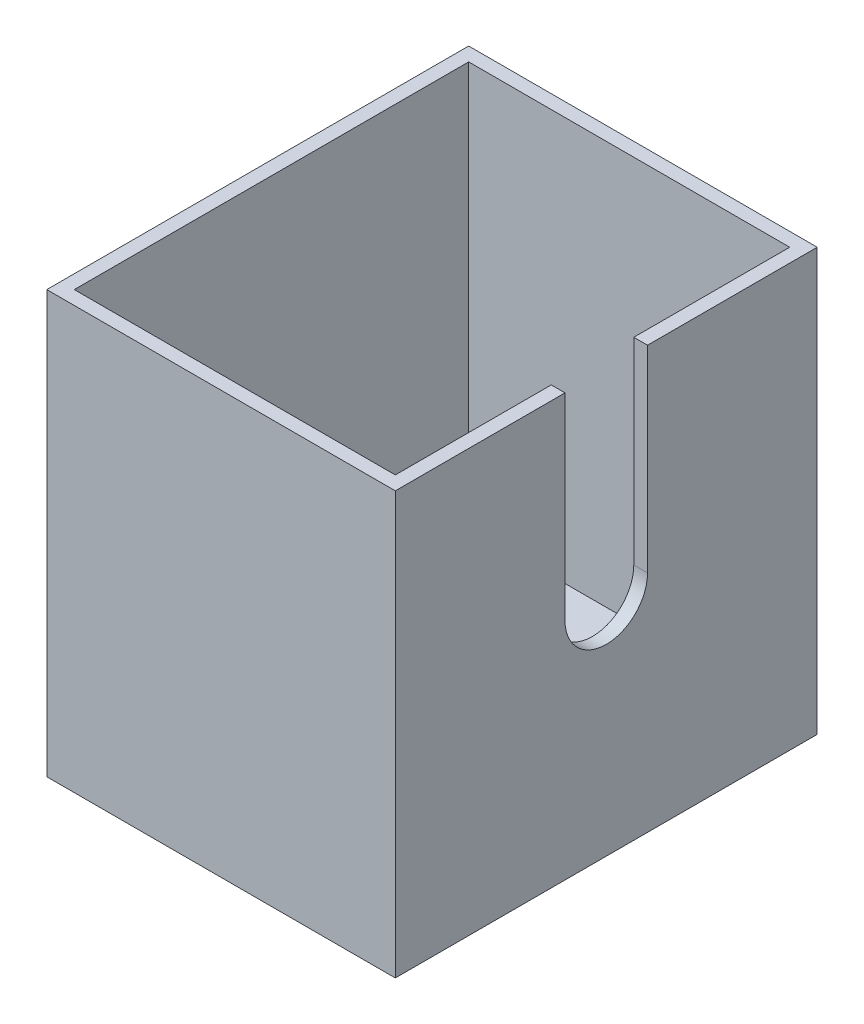
ISO-10303-21;
HEADER;
FILE_DESCRIPTION(('STEP AP214'),'2;1');
FILE_NAME('part.step','',(''),(''),'','','');
FILE_SCHEMA(('AUTOMOTIVE_DESIGN { 1 0 10303 214 1 1 1 1 }'));
ENDSEC;
DATA;
#1=APPLICATION_CONTEXT('core data for automotive mechanical design processes');
#2=APPLICATION_PROTOCOL_DEFINITION('international standard','automotive_design',2000,#1);
#3=PRODUCT_CONTEXT('',#1,'mechanical');
#4=PRODUCT('Part','Part','',(#3));
#5=PRODUCT_RELATED_PRODUCT_CATEGORY('part','',(#4));
#6=PRODUCT_DEFINITION_FORMATION('','',#4);
#7=PRODUCT_DEFINITION_CONTEXT('part definition',#1,'design');
#8=PRODUCT_DEFINITION('design','',#6,#7);
#9=PRODUCT_DEFINITION_SHAPE('','',#8);
#10=(LENGTH_UNIT() NAMED_UNIT(*) SI_UNIT(.MILLI.,.METRE.));
#11=(NAMED_UNIT(*) PLANE_ANGLE_UNIT() SI_UNIT($,.RADIAN.));
#12=(NAMED_UNIT(*) SI_UNIT($,.STERADIAN.) SOLID_ANGLE_UNIT());
#13=UNCERTAINTY_MEASURE_WITH_UNIT(LENGTH_MEASURE(1.E-05),#10,'distance_accuracy_value','');
#14=(GEOMETRIC_REPRESENTATION_CONTEXT(3) GLOBAL_UNCERTAINTY_ASSIGNED_CONTEXT((#13)) GLOBAL_UNIT_ASSIGNED_CONTEXT((#10,
#11,#12)) REPRESENTATION_CONTEXT('',''));
#15=CARTESIAN_POINT('',(0.,0.,0.));
#16=DIRECTION('',(0.,0.,1.));
#17=DIRECTION('',(1.,0.,0.));
#18=AXIS2_PLACEMENT_3D('',#15,#16,#17);
#19=CARTESIAN_POINT('',(129.653184518172,-19.9,52.2));
#20=DIRECTION('',(0.,1.,0.));
#21=DIRECTION('',(-1.,0.,0.));
#22=AXIS2_PLACEMENT_3D('',#19,#20,#21);
#23=PLANE('',#22);
#24=DIRECTION('',(0.,0.,1.));
#25=VECTOR('',#24,1.);
#26=CARTESIAN_POINT('',(-15.9,-19.9,52.2));
#27=LINE('',#26,#25);
#28=CARTESIAN_POINT('',(-15.9,-19.9,3.1));
#29=VERTEX_POINT('',#28);
#30=CARTESIAN_POINT('',(-15.9,-19.9,49.1));
#31=VERTEX_POINT('',#30);
#32=EDGE_CURVE('E204',#29,#31,#27,.T.);
#33=ORIENTED_EDGE('',*,*,#32,.F.);
#34=DIRECTION('',(1.,0.,0.));
#35=VECTOR('',#34,1.);
#36=CARTESIAN_POINT('',(22.1,-19.9,3.1));
#37=LINE('',#36,#35);
#38=CARTESIAN_POINT('',(22.1,-19.9,3.1));
#39=VERTEX_POINT('',#38);
#40=EDGE_CURVE('E183',#29,#39,#37,.T.);
#41=ORIENTED_EDGE('',*,*,#40,.T.);
#42=DIRECTION('',(0.,0.,1.));
#43=VECTOR('',#42,1.);
#44=CARTESIAN_POINT('',(22.1,-19.9,52.2));
#45=LINE('',#44,#43);
#46=CARTESIAN_POINT('',(22.1,-19.9,49.1));
#47=VERTEX_POINT('',#46);
#48=EDGE_CURVE('E206',#39,#47,#45,.T.);
#49=ORIENTED_EDGE('',*,*,#48,.T.);
#50=DIRECTION('',(1.,0.,0.));
#51=VECTOR('',#50,1.);
#52=CARTESIAN_POINT('',(22.1,-19.9,49.1));
#53=LINE('',#52,#51);
#54=EDGE_CURVE('E194',#31,#47,#53,.T.);
#55=ORIENTED_EDGE('',*,*,#54,.F.);
#56=EDGE_LOOP('',(#33,#41,#49,#55));
#57=FACE_BOUND('',#56,.T.);
#58=ADVANCED_FACE('F33',(#57),#23,.F.);
#59=CARTESIAN_POINT('',(22.1,26.1,52.2));
#60=DIRECTION('',(-1.,0.,0.));
#61=DIRECTION('',(0.,-1.,0.));
#62=AXIS2_PLACEMENT_3D('',#59,#60,#61);
#63=PLANE('',#62);
#64=ORIENTED_EDGE('',*,*,#48,.F.);
#65=DIRECTION('',(0.,-1.,0.));
#66=VECTOR('',#65,1.);
#67=CARTESIAN_POINT('',(22.1,188.847401986937,3.1));
#68=LINE('',#67,#66);
#69=CARTESIAN_POINT('',(22.1,26.1,3.1));
#70=VERTEX_POINT('',#69);
#71=EDGE_CURVE('E190',#70,#39,#68,.T.);
#72=ORIENTED_EDGE('',*,*,#71,.F.);
#73=DIRECTION('',(0.,0.,-1.));
#74=VECTOR('',#73,1.);
#75=CARTESIAN_POINT('',(22.1,26.1,52.2));
#76=LINE('',#75,#74);
#77=CARTESIAN_POINT('',(22.1,26.1,21.6));
#78=VERTEX_POINT('',#77);
#79=EDGE_CURVE('E41',#78,#70,#76,.T.);
#80=ORIENTED_EDGE('',*,*,#79,.F.);
#81=DIRECTION('',(0.,-1.,0.));
#82=VECTOR('',#81,1.);
#83=CARTESIAN_POINT('',(22.1,26.1,21.6));
#84=LINE('',#83,#82);
#85=CARTESIAN_POINT('',(22.1,4.6,21.6));
#86=VERTEX_POINT('',#85);
#87=EDGE_CURVE('E48',#78,#86,#84,.T.);
#88=ORIENTED_EDGE('',*,*,#87,.T.);
#89=CARTESIAN_POINT('',(22.1,4.6,26.1));
#90=DIRECTION('',(-1.,0.,0.));
#91=DIRECTION('',(0.,-1.,0.));
#92=AXIS2_PLACEMENT_3D('',#89,#90,#91);
#93=CIRCLE('',#92,4.5);
#94=CARTESIAN_POINT('',(22.1,4.6,30.6));
#95=VERTEX_POINT('',#94);
#96=EDGE_CURVE('E52',#86,#95,#93,.T.);
#97=ORIENTED_EDGE('',*,*,#96,.T.);
#98=DIRECTION('',(0.,1.,0.));
#99=VECTOR('',#98,1.);
#100=CARTESIAN_POINT('',(22.1,26.1,30.6));
#101=LINE('',#100,#99);
#102=CARTESIAN_POINT('',(22.1,26.1,30.6));
#103=VERTEX_POINT('',#102);
#104=EDGE_CURVE('E143',#95,#103,#101,.T.);
#105=ORIENTED_EDGE('',*,*,#104,.T.);
#106=CARTESIAN_POINT('',(22.1,26.1,49.1));
#107=VERTEX_POINT('',#106);
#108=EDGE_CURVE('E11',#107,#103,#76,.T.);
#109=ORIENTED_EDGE('',*,*,#108,.F.);
#110=DIRECTION('',(0.,-1.,0.));
#111=VECTOR('',#110,1.);
#112=CARTESIAN_POINT('',(22.1,198.903184518172,49.1));
#113=LINE('',#112,#111);
#114=EDGE_CURVE('E201',#107,#47,#113,.T.);
#115=ORIENTED_EDGE('',*,*,#114,.T.);
#116=EDGE_LOOP('',(#64,#72,#80,#88,#97,#105,#109,#115));
#117=FACE_BOUND('',#116,.T.);
#118=ADVANCED_FACE('F35',(#117),#63,.F.);
#119=CARTESIAN_POINT('',(-22.1,26.1,52.2));
#120=DIRECTION('',(0.,-1.,0.));
#121=DIRECTION('',(0.,0.,-1.));
#122=AXIS2_PLACEMENT_3D('',#119,#120,#121);
#123=PLANE('',#122);
#124=DIRECTION('',(1.,0.,0.));
#125=VECTOR('',#124,1.);
#126=CARTESIAN_POINT('',(22.1,26.1,3.1));
#127=LINE('',#126,#125);
#128=CARTESIAN_POINT('',(-15.9,26.1,3.1));
#129=VERTEX_POINT('',#128);
#130=EDGE_CURVE('E176',#129,#70,#127,.T.);
#131=ORIENTED_EDGE('',*,*,#130,.F.);
#132=DIRECTION('',(0.,0.,1.));
#133=VECTOR('',#132,1.);
#134=CARTESIAN_POINT('',(-15.9,26.1,52.2));
#135=LINE('',#134,#133);
#136=CARTESIAN_POINT('',(-15.9,26.1,49.1));
#137=VERTEX_POINT('',#136);
#138=EDGE_CURVE('E203',#129,#137,#135,.T.);
#139=ORIENTED_EDGE('',*,*,#138,.T.);
#140=DIRECTION('',(1.,0.,0.));
#141=VECTOR('',#140,1.);
#142=CARTESIAN_POINT('',(22.1,26.1,49.1));
#143=LINE('',#142,#141);
#144=EDGE_CURVE('E193',#137,#107,#143,.T.);
#145=ORIENTED_EDGE('',*,*,#144,.T.);
#146=ORIENTED_EDGE('',*,*,#108,.T.);
#147=DIRECTION('',(-1.,0.,0.));
#148=VECTOR('',#147,1.);
#149=CARTESIAN_POINT('',(172.635794751145,26.1,30.6));
#150=LINE('',#149,#148);
#151=CARTESIAN_POINT('',(20.6,26.1,30.6));
#152=VERTEX_POINT('',#151);
#153=EDGE_CURVE('E144',#103,#152,#150,.T.);
#154=ORIENTED_EDGE('',*,*,#153,.T.);
#155=DIRECTION('',(0.,0.,-1.));
#156=VECTOR('',#155,1.);
#157=CARTESIAN_POINT('',(20.6,26.1,47.6));
#158=LINE('',#157,#156);
#159=CARTESIAN_POINT('',(20.6,26.1,47.6));
#160=VERTEX_POINT('',#159);
#161=EDGE_CURVE('E127',#160,#152,#158,.T.);
#162=ORIENTED_EDGE('',*,*,#161,.F.);
#163=DIRECTION('',(1.,0.,0.));
#164=VECTOR('',#163,1.);
#165=CARTESIAN_POINT('',(-14.4,26.1,47.6));
#166=LINE('',#165,#164);
#167=CARTESIAN_POINT('',(-14.4,26.1,47.6));
#168=VERTEX_POINT('',#167);
#169=EDGE_CURVE('E168',#168,#160,#166,.T.);
#170=ORIENTED_EDGE('',*,*,#169,.F.);
#171=DIRECTION('',(0.,0.,1.));
#172=VECTOR('',#171,1.);
#173=CARTESIAN_POINT('',(-14.4,26.1,4.60000000000001));
#174=LINE('',#173,#172);
#175=CARTESIAN_POINT('',(-14.4,26.1,4.60000000000001));
#176=VERTEX_POINT('',#175);
#177=EDGE_CURVE('E165',#176,#168,#174,.T.);
#178=ORIENTED_EDGE('',*,*,#177,.F.);
#179=DIRECTION('',(-1.,0.,0.));
#180=VECTOR('',#179,1.);
#181=CARTESIAN_POINT('',(20.6,26.1,4.6));
#182=LINE('',#181,#180);
#183=CARTESIAN_POINT('',(20.6,26.1,4.6));
#184=VERTEX_POINT('',#183);
#185=EDGE_CURVE('E146',#184,#176,#182,.T.);
#186=ORIENTED_EDGE('',*,*,#185,.F.);
#187=CARTESIAN_POINT('',(20.6,26.1,21.6));
#188=VERTEX_POINT('',#187);
#189=EDGE_CURVE('E171',#188,#184,#158,.T.);
#190=ORIENTED_EDGE('',*,*,#189,.F.);
#191=DIRECTION('',(-1.,0.,0.));
#192=VECTOR('',#191,1.);
#193=CARTESIAN_POINT('',(172.635794751145,26.1,21.6));
#194=LINE('',#193,#192);
#195=EDGE_CURVE('E131',#78,#188,#194,.T.);
#196=ORIENTED_EDGE('',*,*,#195,.F.);
#197=ORIENTED_EDGE('',*,*,#79,.T.);
#198=EDGE_LOOP('',(#131,#139,#145,#146,#154,#162,#170,#178,#186,#190,#196,#197));
#199=FACE_BOUND('',#198,.T.);
#200=ADVANCED_FACE('F215',(#199),#123,.F.);
#201=CARTESIAN_POINT('',(-15.9,198.903184518172,52.2));
#202=DIRECTION('',(-1.,0.,0.));
#203=DIRECTION('',(0.,0.,1.));
#204=AXIS2_PLACEMENT_3D('',#201,#202,#203);
#205=PLANE('',#204);
#206=DIRECTION('',(0.,-1.,0.));
#207=VECTOR('',#206,1.);
#208=CARTESIAN_POINT('',(-15.9,198.903184518172,49.1));
#209=LINE('',#208,#207);
#210=EDGE_CURVE('E197',#137,#31,#209,.T.);
#211=ORIENTED_EDGE('',*,*,#210,.F.);
#212=ORIENTED_EDGE('',*,*,#138,.F.);
#213=DIRECTION('',(0.,-1.,0.));
#214=VECTOR('',#213,1.);
#215=CARTESIAN_POINT('',(-15.9,188.847401986937,3.1));
#216=LINE('',#215,#214);
#217=EDGE_CURVE('E186',#129,#29,#216,.T.);
#218=ORIENTED_EDGE('',*,*,#217,.T.);
#219=ORIENTED_EDGE('',*,*,#32,.T.);
#220=EDGE_LOOP('',(#211,#212,#218,#219));
#221=FACE_BOUND('',#220,.T.);
#222=ADVANCED_FACE('F223',(#221),#205,.T.);
#223=CARTESIAN_POINT('',(22.1,198.903184518172,49.1));
#224=DIRECTION('',(0.,0.,1.));
#225=DIRECTION('',(1.,0.,0.));
#226=AXIS2_PLACEMENT_3D('',#223,#224,#225);
#227=PLANE('',#226);
#228=ORIENTED_EDGE('',*,*,#144,.F.);
#229=ORIENTED_EDGE('',*,*,#210,.T.);
#230=ORIENTED_EDGE('',*,*,#54,.T.);
#231=ORIENTED_EDGE('',*,*,#114,.F.);
#232=EDGE_LOOP('',(#228,#229,#230,#231));
#233=FACE_BOUND('',#232,.T.);
#234=ADVANCED_FACE('F228',(#233),#227,.T.);
#235=CARTESIAN_POINT('',(22.1,188.847401986937,3.1));
#236=DIRECTION('',(0.,0.,1.));
#237=DIRECTION('',(1.,0.,0.));
#238=AXIS2_PLACEMENT_3D('',#235,#236,#237);
#239=PLANE('',#238);
#240=ORIENTED_EDGE('',*,*,#130,.T.);
#241=ORIENTED_EDGE('',*,*,#71,.T.);
#242=ORIENTED_EDGE('',*,*,#40,.F.);
#243=ORIENTED_EDGE('',*,*,#217,.F.);
#244=EDGE_LOOP('',(#240,#241,#242,#243));
#245=FACE_BOUND('',#244,.T.);
#246=ADVANCED_FACE('F220',(#245),#239,.F.);
#247=CARTESIAN_POINT('',(20.6,-17.9,4.6));
#248=DIRECTION('',(0.,0.,-1.));
#249=DIRECTION('',(-1.,0.,0.));
#250=AXIS2_PLACEMENT_3D('',#247,#248,#249);
#251=PLANE('',#250);
#252=ORIENTED_EDGE('',*,*,#185,.T.);
#253=DIRECTION('',(0.,1.,0.));
#254=VECTOR('',#253,1.);
#255=CARTESIAN_POINT('',(-14.4,-17.9,4.60000000000001));
#256=LINE('',#255,#254);
#257=CARTESIAN_POINT('',(-14.4,-17.9,4.60000000000001));
#258=VERTEX_POINT('',#257);
#259=EDGE_CURVE('E163',#258,#176,#256,.T.);
#260=ORIENTED_EDGE('',*,*,#259,.F.);
#261=DIRECTION('',(-1.,0.,0.));
#262=VECTOR('',#261,1.);
#263=CARTESIAN_POINT('',(20.6,-17.9,4.6));
#264=LINE('',#263,#262);
#265=CARTESIAN_POINT('',(20.6,-17.9,4.6));
#266=VERTEX_POINT('',#265);
#267=EDGE_CURVE('E151',#266,#258,#264,.T.);
#268=ORIENTED_EDGE('',*,*,#267,.F.);
#269=DIRECTION('',(0.,1.,0.));
#270=VECTOR('',#269,1.);
#271=CARTESIAN_POINT('',(20.6,-17.9,4.6));
#272=LINE('',#271,#270);
#273=EDGE_CURVE('E173',#266,#184,#272,.T.);
#274=ORIENTED_EDGE('',*,*,#273,.T.);
#275=EDGE_LOOP('',(#252,#260,#268,#274));
#276=FACE_BOUND('',#275,.T.);
#277=ADVANCED_FACE('F240',(#276),#251,.F.);
#278=CARTESIAN_POINT('',(20.6,-17.9,47.6));
#279=DIRECTION('',(1.,0.,0.));
#280=DIRECTION('',(0.,0.,-1.));
#281=AXIS2_PLACEMENT_3D('',#278,#279,#280);
#282=PLANE('',#281);
#283=DIRECTION('',(0.,-1.,0.));
#284=VECTOR('',#283,1.);
#285=CARTESIAN_POINT('',(20.6,26.1,21.6));
#286=LINE('',#285,#284);
#287=CARTESIAN_POINT('',(20.6,4.6,21.6));
#288=VERTEX_POINT('',#287);
#289=EDGE_CURVE('E140',#188,#288,#286,.T.);
#290=ORIENTED_EDGE('',*,*,#289,.F.);
#291=ORIENTED_EDGE('',*,*,#189,.T.);
#292=ORIENTED_EDGE('',*,*,#273,.F.);
#293=DIRECTION('',(0.,0.,-1.));
#294=VECTOR('',#293,1.);
#295=CARTESIAN_POINT('',(20.6,-17.9,47.6));
#296=LINE('',#295,#294);
#297=CARTESIAN_POINT('',(20.6,-17.9,47.6));
#298=VERTEX_POINT('',#297);
#299=EDGE_CURVE('E160',#298,#266,#296,.T.);
#300=ORIENTED_EDGE('',*,*,#299,.F.);
#301=DIRECTION('',(0.,1.,0.));
#302=VECTOR('',#301,1.);
#303=CARTESIAN_POINT('',(20.6,-17.9,47.6));
#304=LINE('',#303,#302);
#305=EDGE_CURVE('E177',#298,#160,#304,.T.);
#306=ORIENTED_EDGE('',*,*,#305,.T.);
#307=ORIENTED_EDGE('',*,*,#161,.T.);
#308=DIRECTION('',(0.,1.,0.));
#309=VECTOR('',#308,1.);
#310=CARTESIAN_POINT('',(20.6,26.1,30.6));
#311=LINE('',#310,#309);
#312=CARTESIAN_POINT('',(20.6,4.59999999999999,30.6));
#313=VERTEX_POINT('',#312);
#314=EDGE_CURVE('E121',#313,#152,#311,.T.);
#315=ORIENTED_EDGE('',*,*,#314,.F.);
#316=CARTESIAN_POINT('',(20.6,4.6,26.1));
#317=DIRECTION('',(-1.,0.,0.));
#318=DIRECTION('',(0.,-1.,0.));
#319=AXIS2_PLACEMENT_3D('',#316,#317,#318);
#320=CIRCLE('',#319,4.5);
#321=EDGE_CURVE('E124',#288,#313,#320,.T.);
#322=ORIENTED_EDGE('',*,*,#321,.F.);
#323=EDGE_LOOP('',(#290,#291,#292,#300,#306,#307,#315,#322));
#324=FACE_BOUND('',#323,.T.);
#325=ADVANCED_FACE('F123',(#324),#282,.F.);
#326=CARTESIAN_POINT('',(-14.4,-17.9,47.6));
#327=DIRECTION('',(0.,0.,1.));
#328=DIRECTION('',(1.,0.,0.));
#329=AXIS2_PLACEMENT_3D('',#326,#327,#328);
#330=PLANE('',#329);
#331=ORIENTED_EDGE('',*,*,#169,.T.);
#332=ORIENTED_EDGE('',*,*,#305,.F.);
#333=DIRECTION('',(1.,0.,0.));
#334=VECTOR('',#333,1.);
#335=CARTESIAN_POINT('',(-14.4,-17.9,47.6));
#336=LINE('',#335,#334);
#337=CARTESIAN_POINT('',(-14.4,-17.9,47.6));
#338=VERTEX_POINT('',#337);
#339=EDGE_CURVE('E157',#338,#298,#336,.T.);
#340=ORIENTED_EDGE('',*,*,#339,.F.);
#341=DIRECTION('',(0.,1.,0.));
#342=VECTOR('',#341,1.);
#343=CARTESIAN_POINT('',(-14.4,-17.9,47.6));
#344=LINE('',#343,#342);
#345=EDGE_CURVE('E179',#338,#168,#344,.T.);
#346=ORIENTED_EDGE('',*,*,#345,.T.);
#347=EDGE_LOOP('',(#331,#332,#340,#346));
#348=FACE_BOUND('',#347,.T.);
#349=ADVANCED_FACE('F233',(#348),#330,.F.);
#350=CARTESIAN_POINT('',(-14.4,-17.9,4.60000000000001));
#351=DIRECTION('',(-1.,0.,0.));
#352=DIRECTION('',(0.,0.,1.));
#353=AXIS2_PLACEMENT_3D('',#350,#351,#352);
#354=PLANE('',#353);
#355=ORIENTED_EDGE('',*,*,#177,.T.);
#356=ORIENTED_EDGE('',*,*,#345,.F.);
#357=DIRECTION('',(0.,0.,1.));
#358=VECTOR('',#357,1.);
#359=CARTESIAN_POINT('',(-14.4,-17.9,4.60000000000001));
#360=LINE('',#359,#358);
#361=EDGE_CURVE('E154',#258,#338,#360,.T.);
#362=ORIENTED_EDGE('',*,*,#361,.F.);
#363=ORIENTED_EDGE('',*,*,#259,.T.);
#364=EDGE_LOOP('',(#355,#356,#362,#363));
#365=FACE_BOUND('',#364,.T.);
#366=ADVANCED_FACE('F237',(#365),#354,.F.);
#367=CARTESIAN_POINT('',(0.,-17.9,0.));
#368=DIRECTION('',(0.,1.,0.));
#369=DIRECTION('',(0.,0.,1.));
#370=AXIS2_PLACEMENT_3D('',#367,#368,#369);
#371=PLANE('',#370);
#372=ORIENTED_EDGE('',*,*,#267,.T.);
#373=ORIENTED_EDGE('',*,*,#361,.T.);
#374=ORIENTED_EDGE('',*,*,#339,.T.);
#375=ORIENTED_EDGE('',*,*,#299,.T.);
#376=EDGE_LOOP('',(#372,#373,#374,#375));
#377=FACE_BOUND('',#376,.T.);
#378=ADVANCED_FACE('F276',(#377),#371,.T.);
#379=CARTESIAN_POINT('',(172.635794751145,26.1,30.6));
#380=DIRECTION('',(0.,0.,-1.));
#381=DIRECTION('',(0.,1.,0.));
#382=AXIS2_PLACEMENT_3D('',#379,#380,#381);
#383=PLANE('',#382);
#384=ORIENTED_EDGE('',*,*,#104,.F.);
#385=DIRECTION('',(-1.,0.,0.));
#386=VECTOR('',#385,1.);
#387=CARTESIAN_POINT('',(172.635794751145,4.60000000000003,30.6));
#388=LINE('',#387,#386);
#389=EDGE_CURVE('E137',#95,#313,#388,.T.);
#390=ORIENTED_EDGE('',*,*,#389,.T.);
#391=ORIENTED_EDGE('',*,*,#314,.T.);
#392=ORIENTED_EDGE('',*,*,#153,.F.);
#393=EDGE_LOOP('',(#384,#390,#391,#392));
#394=FACE_BOUND('',#393,.T.);
#395=ADVANCED_FACE('F142',(#394),#383,.T.);
#396=CARTESIAN_POINT('',(172.635794751145,4.60000000000003,26.1));
#397=DIRECTION('',(-1.,0.,0.));
#398=DIRECTION('',(0.,-1.,0.));
#399=AXIS2_PLACEMENT_3D('',#396,#397,#398);
#400=CYLINDRICAL_SURFACE('',#399,4.5);
#401=ORIENTED_EDGE('',*,*,#96,.F.);
#402=DIRECTION('',(-1.,0.,0.));
#403=VECTOR('',#402,1.);
#404=CARTESIAN_POINT('',(172.635794751145,4.60000000000003,21.6));
#405=LINE('',#404,#403);
#406=EDGE_CURVE('E139',#86,#288,#405,.T.);
#407=ORIENTED_EDGE('',*,*,#406,.T.);
#408=ORIENTED_EDGE('',*,*,#321,.T.);
#409=ORIENTED_EDGE('',*,*,#389,.F.);
#410=EDGE_LOOP('',(#401,#407,#408,#409));
#411=FACE_BOUND('',#410,.T.);
#412=ADVANCED_FACE('F136',(#411),#400,.F.);
#413=CARTESIAN_POINT('',(172.635794751145,26.1,21.6));
#414=DIRECTION('',(0.,0.,1.));
#415=DIRECTION('',(0.,-1.,0.));
#416=AXIS2_PLACEMENT_3D('',#413,#414,#415);
#417=PLANE('',#416);
#418=ORIENTED_EDGE('',*,*,#87,.F.);
#419=ORIENTED_EDGE('',*,*,#195,.T.);
#420=ORIENTED_EDGE('',*,*,#289,.T.);
#421=ORIENTED_EDGE('',*,*,#406,.F.);
#422=EDGE_LOOP('',(#418,#419,#420,#421));
#423=FACE_BOUND('',#422,.T.);
#424=ADVANCED_FACE('F242',(#423),#417,.T.);
#425=CLOSED_SHELL('',(#58,#118,#200,#222,#234,#246,#277,#325,#349,#366,#378,#395,#412,#424));
#426=MANIFOLD_SOLID_BREP('B2',#425);
#427=ADVANCED_BREP_SHAPE_REPRESENTATION('',(#18,#426),#14);
#428=SHAPE_DEFINITION_REPRESENTATION(#9,#427);
ENDSEC;
END-ISO-10303-21;
